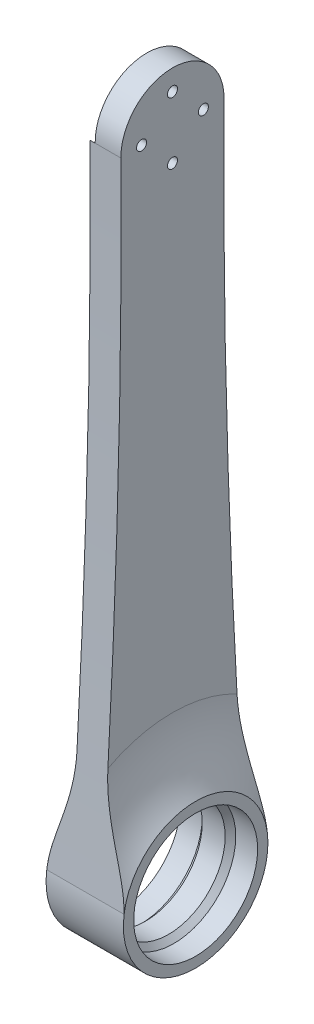
ISO-10303-21;
HEADER;
FILE_DESCRIPTION(('STEP AP214'),'2;1');
FILE_NAME('part.step','',(''),(''),'','','');
FILE_SCHEMA(('AUTOMOTIVE_DESIGN { 1 0 10303 214 1 1 1 1 }'));
ENDSEC;
DATA;
#1=APPLICATION_CONTEXT('core data for automotive mechanical design processes');
#2=APPLICATION_PROTOCOL_DEFINITION('international standard','automotive_design',2000,#1);
#3=PRODUCT_CONTEXT('',#1,'mechanical');
#4=PRODUCT('Part','Part','',(#3));
#5=PRODUCT_RELATED_PRODUCT_CATEGORY('part','',(#4));
#6=PRODUCT_DEFINITION_FORMATION('','',#4);
#7=PRODUCT_DEFINITION_CONTEXT('part definition',#1,'design');
#8=PRODUCT_DEFINITION('design','',#6,#7);
#9=PRODUCT_DEFINITION_SHAPE('','',#8);
#10=(LENGTH_UNIT() NAMED_UNIT(*) SI_UNIT(.MILLI.,.METRE.));
#11=(NAMED_UNIT(*) PLANE_ANGLE_UNIT() SI_UNIT($,.RADIAN.));
#12=(NAMED_UNIT(*) SI_UNIT($,.STERADIAN.) SOLID_ANGLE_UNIT());
#13=UNCERTAINTY_MEASURE_WITH_UNIT(LENGTH_MEASURE(1.E-05),#10,'distance_accuracy_value','');
#14=(GEOMETRIC_REPRESENTATION_CONTEXT(3) GLOBAL_UNCERTAINTY_ASSIGNED_CONTEXT((#13)) GLOBAL_UNIT_ASSIGNED_CONTEXT((#10,
#11,#12)) REPRESENTATION_CONTEXT('',''));
#15=CARTESIAN_POINT('',(0.,0.,0.));
#16=DIRECTION('',(0.,0.,1.));
#17=DIRECTION('',(1.,0.,0.));
#18=AXIS2_PLACEMENT_3D('',#15,#16,#17);
#19=CARTESIAN_POINT('',(12.5000099997899,2.24808958651116E-11,-481.831385650788));
#20=DIRECTION('',(-1.,-3.56744395928794E-13,3.81916720471054E-13));
#21=DIRECTION('',(3.56744395928794E-13,-1.,0.));
#22=AXIS2_PLACEMENT_3D('',#19,#20,#21);
#23=CYLINDRICAL_SURFACE('',#22,20.);
#24=DIRECTION('',(1.,3.56744395928794E-13,-3.81916720471054E-13));
#25=VECTOR('',#24,1.);
#26=CARTESIAN_POINT('',(0.500009999797657,-0.302746842978571,-461.833677173334));
#27=LINE('',#26,#25);
#28=CARTESIAN_POINT('',(2.50000999979766,-0.302746842977857,-461.833677173334));
#29=VERTEX_POINT('',#28);
#30=CARTESIAN_POINT('',(12.5000099997977,-0.30274684297429,-461.833677173338));
#31=VERTEX_POINT('',#30);
#32=EDGE_CURVE('E166',#29,#31,#27,.T.);
#33=ORIENTED_EDGE('',*,*,#32,.T.);
#34=CARTESIAN_POINT('',(12.5000099997899,2.24808958651116E-11,-481.831385650788));
#35=DIRECTION('',(-1.,-3.56744395928794E-13,3.81916720471054E-13));
#36=DIRECTION('',(-3.56744395928794E-13,1.,0.));
#37=AXIS2_PLACEMENT_3D('',#34,#35,#36);
#38=CIRCLE('',#37,20.);
#39=CARTESIAN_POINT('',(12.5000099997825,-0.302746842975287,-501.829094128237));
#40=VERTEX_POINT('',#39);
#41=EDGE_CURVE('E160',#31,#40,#38,.T.);
#42=ORIENTED_EDGE('',*,*,#41,.T.);
#43=DIRECTION('',(1.,3.56744395928794E-13,-3.81916720471054E-13));
#44=VECTOR('',#43,1.);
#45=CARTESIAN_POINT('',(0.500009999782502,-0.302746842979568,-501.829094128232));
#46=LINE('',#45,#44);
#47=CARTESIAN_POINT('',(2.5000099997825,-0.302746842978854,-501.829094128233));
#48=VERTEX_POINT('',#47);
#49=EDGE_CURVE('E163',#48,#40,#46,.T.);
#50=ORIENTED_EDGE('',*,*,#49,.F.);
#51=CARTESIAN_POINT('',(2.50000999979011,1.89134519058236E-11,-481.831385650784));
#52=DIRECTION('',(-1.,-3.56744395928794E-13,3.81916720471054E-13));
#53=DIRECTION('',(-3.56744395928794E-13,1.,0.));
#54=AXIS2_PLACEMENT_3D('',#51,#52,#53);
#55=CIRCLE('',#54,20.);
#56=EDGE_CURVE('E157',#29,#48,#55,.T.);
#57=ORIENTED_EDGE('',*,*,#56,.F.);
#58=EDGE_LOOP('',(#33,#42,#50,#57));
#59=FACE_BOUND('',#58,.T.);
#60=ADVANCED_FACE('F37',(#59),#23,.T.);
#61=CARTESIAN_POINT('',(12.5000099997899,2.24808958651116E-11,-481.831385650788));
#62=DIRECTION('',(1.,3.56744395928794E-13,-3.81916720471054E-13));
#63=DIRECTION('',(-3.56744395928794E-13,1.,0.));
#64=AXIS2_PLACEMENT_3D('',#61,#62,#63);
#65=PLANE('',#64);
#66=CARTESIAN_POINT('',(12.5000099997857,11.999999999987,-481.831385650788));
#67=DIRECTION('',(-1.,-3.56744395928794E-13,3.81916720471054E-13));
#68=DIRECTION('',(-3.56744395928794E-13,1.,0.));
#69=AXIS2_PLACEMENT_3D('',#66,#67,#68);
#70=CIRCLE('',#69,1.95);
#71=CARTESIAN_POINT('',(12.500009999785,13.949999999987,-481.831385650788));
#72=VERTEX_POINT('',#71);
#73=EDGE_CURVE('E142',#72,#72,#70,.T.);
#74=ORIENTED_EDGE('',*,*,#73,.T.);
#75=EDGE_LOOP('',(#74));
#76=FACE_BOUND('',#75,.T.);
#77=CARTESIAN_POINT('',(12.5000099997943,-11.999999999978,-481.831385650788));
#78=DIRECTION('',(-1.,-3.56744395928794E-13,3.81916720471054E-13));
#79=DIRECTION('',(-3.56744395928794E-13,1.,0.));
#80=AXIS2_PLACEMENT_3D('',#77,#78,#79);
#81=CIRCLE('',#80,1.95);
#82=CARTESIAN_POINT('',(12.5000099997936,-10.049999999978,-481.831385650788));
#83=VERTEX_POINT('',#82);
#84=EDGE_CURVE('E154',#83,#83,#81,.T.);
#85=ORIENTED_EDGE('',*,*,#84,.T.);
#86=EDGE_LOOP('',(#85));
#87=FACE_BOUND('',#86,.T.);
#88=CARTESIAN_POINT('',(12.5000099997823,2.24808958651116E-11,-501.831385650788));
#89=CARTESIAN_POINT('',(12.5000099998267,-122.992180068807,-500.894319286759));
#90=CARTESIAN_POINT('',(12.5000099998684,-249.99999999998,-509.881385650788));
#91=B_SPLINE_CURVE_WITH_KNOTS('',2,(#88,#89,#90),.UNSPECIFIED.,.F.,.F.,(3,3),(0.,1.),.UNSPECIFIED.);
#92=CARTESIAN_POINT('',(12.5000099998528,-202.922102878342,-506.883234073973));
#93=VERTEX_POINT('',#92);
#94=EDGE_CURVE('E238',#40,#93,#91,.T.);
#95=ORIENTED_EDGE('',*,*,#94,.F.);
#96=ORIENTED_EDGE('',*,*,#41,.F.);
#97=CARTESIAN_POINT('',(12.5000099997977,2.24857944523082E-11,-461.831385650788));
#98=CARTESIAN_POINT('',(12.5000099998412,-122.992180068807,-462.768452014816));
#99=CARTESIAN_POINT('',(12.5000099998899,-249.99999999998,-453.781385650788));
#100=B_SPLINE_CURVE_WITH_KNOTS('',2,(#97,#98,#99),.UNSPECIFIED.,.F.,.F.,(3,3),(0.,1.),.UNSPECIFIED.);
#101=CARTESIAN_POINT('',(12.5000099998719,-202.922102878342,-456.779537227603));
#102=VERTEX_POINT('',#101);
#103=EDGE_CURVE('E120',#31,#102,#100,.T.);
#104=ORIENTED_EDGE('',*,*,#103,.T.);
#105=CARTESIAN_POINT('',(12.5000099998792,-249.999999999981,-481.831385650788));
#106=DIRECTION('',(-1.,-3.56744395928794E-13,3.81916720471054E-13));
#107=DIRECTION('',(-3.56744395928794E-13,1.,0.));
#108=AXIS2_PLACEMENT_3D('',#105,#106,#107);
#109=CIRCLE('',#108,53.3284493194197);
#110=EDGE_CURVE('E171',#93,#102,#109,.F.);
#111=ORIENTED_EDGE('',*,*,#110,.F.);
#112=EDGE_LOOP('',(#95,#96,#104,#111));
#113=FACE_BOUND('',#112,.T.);
#114=CARTESIAN_POINT('',(12.5000099997946,4.45930851655388E-12,-469.831385650787));
#115=DIRECTION('',(-1.,-3.56744395928794E-13,3.81916720471054E-13));
#116=DIRECTION('',(-3.56744395928794E-13,1.,0.));
#117=AXIS2_PLACEMENT_3D('',#114,#115,#116);
#118=CIRCLE('',#117,1.95);
#119=CARTESIAN_POINT('',(12.5000099997939,1.95000000000446,-469.831385650787));
#120=VERTEX_POINT('',#119);
#121=EDGE_CURVE('E148',#120,#120,#118,.T.);
#122=ORIENTED_EDGE('',*,*,#121,.T.);
#123=EDGE_LOOP('',(#122));
#124=FACE_BOUND('',#123,.T.);
#125=CARTESIAN_POINT('',(12.5000099997854,4.45930851655388E-12,-493.831385650788));
#126=DIRECTION('',(-1.,-3.56744395928794E-13,3.81916720471054E-13));
#127=DIRECTION('',(-3.56744395928794E-13,1.,0.));
#128=AXIS2_PLACEMENT_3D('',#125,#126,#127);
#129=CIRCLE('',#128,1.95);
#130=CARTESIAN_POINT('',(12.5000099997847,1.95000000000446,-493.831385650788));
#131=VERTEX_POINT('',#130);
#132=EDGE_CURVE('E134',#131,#131,#129,.T.);
#133=ORIENTED_EDGE('',*,*,#132,.T.);
#134=EDGE_LOOP('',(#133));
#135=FACE_BOUND('',#134,.T.);
#136=ADVANCED_FACE('F195',(#76,#87,#113,#124,#135),#65,.T.);
#137=CARTESIAN_POINT('',(2.50000999979011,1.89134519058236E-11,-481.831385650784));
#138=DIRECTION('',(1.,3.56744395928794E-13,-3.81916720471054E-13));
#139=DIRECTION('',(-3.56744395928794E-13,1.,0.));
#140=AXIS2_PLACEMENT_3D('',#137,#138,#139);
#141=PLANE('',#140);
#142=EDGE_CURVE('E124',#48,#29,#55,.T.);
#143=ORIENTED_EDGE('',*,*,#142,.T.);
#144=ORIENTED_EDGE('',*,*,#56,.T.);
#145=EDGE_LOOP('',(#143,#144));
#146=FACE_BOUND('',#145,.T.);
#147=CARTESIAN_POINT('',(2.50000999979433,-11.9999999999816,-481.831385650784));
#148=DIRECTION('',(-1.,-3.56744395928794E-13,3.81916720471054E-13));
#149=DIRECTION('',(-3.56744395928794E-13,1.,0.));
#150=AXIS2_PLACEMENT_3D('',#147,#148,#149);
#151=CIRCLE('',#150,1.95);
#152=CARTESIAN_POINT('',(2.50000999979363,-10.0499999999816,-481.831385650784));
#153=VERTEX_POINT('',#152);
#154=EDGE_CURVE('E151',#153,#153,#151,.T.);
#155=ORIENTED_EDGE('',*,*,#154,.F.);
#156=EDGE_LOOP('',(#155));
#157=FACE_BOUND('',#156,.T.);
#158=CARTESIAN_POINT('',(2.50000999979455,8.91864557265945E-13,-469.831385650783));
#159=DIRECTION('',(-1.,-3.56744395928794E-13,3.81916720471054E-13));
#160=DIRECTION('',(-3.56744395928794E-13,1.,0.));
#161=AXIS2_PLACEMENT_3D('',#158,#159,#160);
#162=CIRCLE('',#161,1.95);
#163=CARTESIAN_POINT('',(2.50000999979385,1.95000000000089,-469.831385650783));
#164=VERTEX_POINT('',#163);
#165=EDGE_CURVE('E145',#164,#164,#162,.T.);
#166=ORIENTED_EDGE('',*,*,#165,.F.);
#167=EDGE_LOOP('',(#166));
#168=FACE_BOUND('',#167,.T.);
#169=CARTESIAN_POINT('',(2.50000999978567,11.9999999999834,-481.831385650784));
#170=DIRECTION('',(-1.,-3.56744395928794E-13,3.81916720471054E-13));
#171=DIRECTION('',(-3.56744395928794E-13,1.,0.));
#172=AXIS2_PLACEMENT_3D('',#169,#170,#171);
#173=CIRCLE('',#172,1.95);
#174=CARTESIAN_POINT('',(2.50000999978497,13.9499999999834,-481.831385650784));
#175=VERTEX_POINT('',#174);
#176=EDGE_CURVE('E137',#175,#175,#173,.T.);
#177=ORIENTED_EDGE('',*,*,#176,.F.);
#178=EDGE_LOOP('',(#177));
#179=FACE_BOUND('',#178,.T.);
#180=CARTESIAN_POINT('',(2.50000999978539,8.91864557265945E-13,-493.831385650784));
#181=DIRECTION('',(-1.,-3.56744395928794E-13,3.81916720471054E-13));
#182=DIRECTION('',(-3.56744395928794E-13,1.,0.));
#183=AXIS2_PLACEMENT_3D('',#180,#181,#182);
#184=CIRCLE('',#183,1.95);
#185=CARTESIAN_POINT('',(2.5000099997847,1.95000000000089,-493.831385650784));
#186=VERTEX_POINT('',#185);
#187=EDGE_CURVE('E138',#186,#186,#184,.T.);
#188=ORIENTED_EDGE('',*,*,#187,.F.);
#189=EDGE_LOOP('',(#188));
#190=FACE_BOUND('',#189,.T.);
#191=ADVANCED_FACE('F197',(#146,#157,#168,#179,#190),#141,.F.);
#192=CARTESIAN_POINT('',(12.5000099997943,-11.999999999978,-481.831385650788));
#193=DIRECTION('',(-1.,-3.56744395928794E-13,3.81916720471054E-13));
#194=DIRECTION('',(3.56744395928794E-13,-1.,0.));
#195=AXIS2_PLACEMENT_3D('',#192,#193,#194);
#196=CYLINDRICAL_SURFACE('',#195,1.95);
#197=ORIENTED_EDGE('',*,*,#84,.F.);
#198=EDGE_LOOP('',(#197));
#199=FACE_BOUND('',#198,.T.);
#200=ORIENTED_EDGE('',*,*,#154,.T.);
#201=EDGE_LOOP('',(#200));
#202=FACE_BOUND('',#201,.T.);
#203=ADVANCED_FACE('F200',(#199,#202),#196,.F.);
#204=CARTESIAN_POINT('',(12.5000099997946,4.45930851655388E-12,-469.831385650787));
#205=DIRECTION('',(-1.,-3.56744395928794E-13,3.81916720471054E-13));
#206=DIRECTION('',(3.56744395928794E-13,-1.,0.));
#207=AXIS2_PLACEMENT_3D('',#204,#205,#206);
#208=CYLINDRICAL_SURFACE('',#207,1.95);
#209=ORIENTED_EDGE('',*,*,#121,.F.);
#210=EDGE_LOOP('',(#209));
#211=FACE_BOUND('',#210,.T.);
#212=ORIENTED_EDGE('',*,*,#165,.T.);
#213=EDGE_LOOP('',(#212));
#214=FACE_BOUND('',#213,.T.);
#215=ADVANCED_FACE('F207',(#211,#214),#208,.F.);
#216=CARTESIAN_POINT('',(12.5000099997857,11.999999999987,-481.831385650788));
#217=DIRECTION('',(-1.,-3.56744395928794E-13,3.81916720471054E-13));
#218=DIRECTION('',(3.56744395928794E-13,-1.,0.));
#219=AXIS2_PLACEMENT_3D('',#216,#217,#218);
#220=CYLINDRICAL_SURFACE('',#219,1.95);
#221=ORIENTED_EDGE('',*,*,#73,.F.);
#222=EDGE_LOOP('',(#221));
#223=FACE_BOUND('',#222,.T.);
#224=ORIENTED_EDGE('',*,*,#176,.T.);
#225=EDGE_LOOP('',(#224));
#226=FACE_BOUND('',#225,.T.);
#227=ADVANCED_FACE('F211',(#223,#226),#220,.F.);
#228=CARTESIAN_POINT('',(12.5000099997854,4.45930851655388E-12,-493.831385650788));
#229=DIRECTION('',(-1.,-3.56744395928794E-13,3.81916720471054E-13));
#230=DIRECTION('',(3.56744395928794E-13,-1.,0.));
#231=AXIS2_PLACEMENT_3D('',#228,#229,#230);
#232=CYLINDRICAL_SURFACE('',#231,1.95);
#233=ORIENTED_EDGE('',*,*,#132,.F.);
#234=EDGE_LOOP('',(#233));
#235=FACE_BOUND('',#234,.T.);
#236=ORIENTED_EDGE('',*,*,#187,.T.);
#237=EDGE_LOOP('',(#236));
#238=FACE_BOUND('',#237,.T.);
#239=ADVANCED_FACE('F215',(#235,#238),#232,.F.);
#240=CARTESIAN_POINT('',(0.500009999790108,1.81999631139661E-11,-481.831385650783));
#241=DIRECTION('',(1.,3.56744395928794E-13,-3.81916720471054E-13));
#242=DIRECTION('',(-3.56744395928794E-13,1.,0.));
#243=AXIS2_PLACEMENT_3D('',#240,#241,#242);
#244=CYLINDRICAL_SURFACE('',#243,20.);
#245=DIRECTION('',(1.,3.56744395928794E-13,-3.81916720471054E-13));
#246=VECTOR('',#245,1.);
#247=CARTESIAN_POINT('',(0.500009999782502,-0.302746842979568,-501.829094128232));
#248=LINE('',#247,#246);
#249=CARTESIAN_POINT('',(0.500009999782502,-0.302746842979568,-501.829094128232));
#250=VERTEX_POINT('',#249);
#251=EDGE_CURVE('E106',#250,#48,#248,.T.);
#252=ORIENTED_EDGE('',*,*,#251,.F.);
#253=CARTESIAN_POINT('',(0.500009999790108,1.81999631139661E-11,-481.831385650783));
#254=DIRECTION('',(-1.,-3.56744273356773E-13,3.81916720471054E-13));
#255=DIRECTION('',(-3.56744273356773E-13,1.,0.));
#256=AXIS2_PLACEMENT_3D('',#253,#254,#255);
#257=CIRCLE('',#256,20.);
#258=CARTESIAN_POINT('',(0.500009999797657,-0.302746842978571,-461.833677173334));
#259=VERTEX_POINT('',#258);
#260=EDGE_CURVE('E113',#250,#259,#257,.T.);
#261=ORIENTED_EDGE('',*,*,#260,.T.);
#262=DIRECTION('',(1.,3.56744395928794E-13,-3.81916720471054E-13));
#263=VECTOR('',#262,1.);
#264=CARTESIAN_POINT('',(0.500009999797657,-0.302746842978571,-461.833677173334));
#265=LINE('',#264,#263);
#266=EDGE_CURVE('E141',#259,#29,#265,.T.);
#267=ORIENTED_EDGE('',*,*,#266,.T.);
#268=ORIENTED_EDGE('',*,*,#142,.F.);
#269=EDGE_LOOP('',(#252,#261,#267,#268));
#270=FACE_BOUND('',#269,.T.);
#271=ADVANCED_FACE('F122',(#270),#244,.F.);
#272=CARTESIAN_POINT('',(0.500009999797657,1.82048617011626E-11,-461.831385650783));
#273=CARTESIAN_POINT('',(0.500009999841178,-122.992180068812,-462.768452014812));
#274=CARTESIAN_POINT('',(0.500009999889917,-249.999999999985,-453.781385650783));
#275=B_SPLINE_CURVE_WITH_KNOTS('',2,(#272,#273,#274),.UNSPECIFIED.,.F.,.F.,(3,3),(0.,1.),.UNSPECIFIED.);
#276=DIRECTION('',(1.,3.56744395928794E-13,-3.81916720471054E-13));
#277=VECTOR('',#276,1.);
#278=SURFACE_OF_LINEAR_EXTRUSION('',#275,#277);
#279=ORIENTED_EDGE('',*,*,#103,.F.);
#280=ORIENTED_EDGE('',*,*,#32,.F.);
#281=ORIENTED_EDGE('',*,*,#266,.F.);
#282=CARTESIAN_POINT('',(0.500009999871931,-202.922102878079,-456.779537227613));
#283=VERTEX_POINT('',#282);
#284=EDGE_CURVE('E112',#259,#283,#275,.T.);
#285=ORIENTED_EDGE('',*,*,#284,.T.);
#286=CARTESIAN_POINT('',(-8.4999900001993,-246.082508761869,-454.056293168497));
#287=CARTESIAN_POINT('',(-8.47780124457364,-245.697302445124,-454.083099189043));
#288=CARTESIAN_POINT('',(-8.44910038244521,-245.312487799194,-454.109811193874));
#289=CARTESIAN_POINT('',(-8.37949399686529,-244.545393738455,-454.162927079009));
#290=CARTESIAN_POINT('',(-8.33863441372825,-244.163110221598,-454.189331737129));
#291=CARTESIAN_POINT('',(-8.2454733122115,-243.400926066505,-454.241845999957));
#292=CARTESIAN_POINT('',(-8.19320130301964,-243.021021835263,-454.267956186268));
#293=CARTESIAN_POINT('',(-8.07812031444582,-242.263407846592,-454.319896912379));
#294=CARTESIAN_POINT('',(-8.01532782893739,-241.885695597032,-454.345727823568));
#295=CARTESIAN_POINT('',(-7.88015878924594,-241.132271514419,-454.397125459872));
#296=CARTESIAN_POINT('',(-7.80778939428738,-240.756558403037,-454.422692367102));
#297=CARTESIAN_POINT('',(-7.65445961360112,-240.006930426495,-454.473577714533));
#298=CARTESIAN_POINT('',(-7.57350032425545,-239.633015338196,-454.498896185994));
#299=CARTESIAN_POINT('',(-7.40398644458714,-238.886731051887,-454.549303462123));
#300=CARTESIAN_POINT('',(-7.3154285736859,-238.514362595091,-454.574392162364));
#301=CARTESIAN_POINT('',(-7.13173120082055,-237.771021693644,-454.62435144349));
#302=CARTESIAN_POINT('',(-7.03658803655111,-237.400050148755,-454.649221894194));
#303=CARTESIAN_POINT('',(-6.84070662371535,-236.659308634767,-454.698758981315));
#304=CARTESIAN_POINT('',(-6.73996462807134,-236.289539650038,-454.723425468229));
#305=CARTESIAN_POINT('',(-6.53384257252319,-235.551016835316,-454.772568122025));
#306=CARTESIAN_POINT('',(-6.42845941550083,-235.182263863178,-454.797044148589));
#307=CARTESIAN_POINT('',(-6.21397601737651,-234.445596713061,-454.845818457908));
#308=CARTESIAN_POINT('',(-6.10487363519271,-234.077683152912,-454.870116628153));
#309=CARTESIAN_POINT('',(-5.88382468995328,-233.342531465404,-454.918546676014));
#310=CARTESIAN_POINT('',(-5.77187693902601,-232.975293691129,-454.942678478648));
#311=CARTESIAN_POINT('',(-5.40999586038022,-231.799506253638,-455.019747088285));
#312=CARTESIAN_POINT('',(-5.15625178627276,-230.992114372056,-455.072373777973));
#313=CARTESIAN_POINT('',(-4.64696802847291,-229.377958863465,-455.176998718855));
#314=CARTESIAN_POINT('',(-4.39142853027719,-228.571195180848,-455.228997033504));
#315=CARTESIAN_POINT('',(-3.88527659243146,-226.956649699534,-455.332469915783));
#316=CARTESIAN_POINT('',(-3.63466107653949,-226.148868895216,-455.383944800055));
#317=CARTESIAN_POINT('',(-3.14409901270373,-224.53095051944,-455.486451556783));
#318=CARTESIAN_POINT('',(-2.90414155119768,-223.720816308151,-455.537483837236));
#319=CARTESIAN_POINT('',(-2.43978492301979,-222.097106370467,-455.639166589348));
#320=CARTESIAN_POINT('',(-2.21536736263337,-221.283535965412,-455.689817446891));
#321=CARTESIAN_POINT('',(-1.78628120717741,-219.652077806925,-455.790782729681));
#322=CARTESIAN_POINT('',(-1.58159187463833,-218.834195561486,-455.841097455299));
#323=CARTESIAN_POINT('',(-1.19585623627954,-217.194510154538,-455.941355718022));
#324=CARTESIAN_POINT('',(-1.01476452337849,-216.372717774196,-455.991299788248));
#325=CARTESIAN_POINT('',(-0.679086302081177,-214.72348509408,-456.090911675775));
#326=CARTESIAN_POINT('',(-0.524506057102014,-213.896043507543,-456.140579425121));
#327=CARTESIAN_POINT('',(-0.244700074379684,-212.234714919652,-456.239673132202));
#328=CARTESIAN_POINT('',(-0.119524529577258,-211.400819371441,-456.289098537503));
#329=CARTESIAN_POINT('',(0.0987705351191311,-209.725813518813,-456.387738116698));
#330=CARTESIAN_POINT('',(0.191775755521887,-208.884688154379,-456.436950936163));
#331=CARTESIAN_POINT('',(0.343052826991372,-207.194397034611,-456.535196796072));
#332=CARTESIAN_POINT('',(0.401123743007653,-206.345212774321,-456.584227214233));
#333=CARTESIAN_POINT('',(0.460020533796629,-205.066648785813,-456.657553190388));
#334=CARTESIAN_POINT('',(0.474953626163886,-204.637897123308,-456.682058467402));
#335=CARTESIAN_POINT('',(0.494949348239617,-203.78013923591,-456.730915809261));
#336=CARTESIAN_POINT('',(0.500011594932706,-203.351133001784,-456.755267868124));
#337=CARTESIAN_POINT('',(0.500009999871931,-202.922102878079,-456.779537227613));
#338=B_SPLINE_CURVE_WITH_KNOTS('',3,(#286,#287,#288,#289,#290,#291,#292,#293,#294,#295,#296,
#297,#298,#299,#300,#301,#302,#303,#304,#305,#306,#307,#308,#309,#310,#311,#312,#313,#314,#315,
#316,#317,#318,#319,#320,#321,#322,#323,#324,#325,#326,#327,#328,#329,#330,#331,#332,#333,#334,
#335,#336,#337),.UNSPECIFIED.,.F.,.F.,(4,2,2,2,2,2,2,2,2,2,2,2,2,2,2,2,2,2,2,2,2,2,2,2,2,4),(0.,
1.16023626743979,2.31614320786222,3.46909598150033,4.62025780043684,5.77056387827698,
6.92072331156419,8.07138183259926,9.22268549698106,10.3747691863162,11.5276336864299,
12.6811734631706,13.8352029917993,16.379057908297,18.9226537584687,21.4646064441353,
24.0038932247779,26.5401211152042,29.0736532711837,31.6022359994823,34.1314152928898,
36.6648809474156,39.2072575790064,41.7641210059503,43.0531542129777,44.3422374369682),.UNSPECIFIED.);
#339=CARTESIAN_POINT('',(-8.4999900001993,-246.082508761868,-454.056293168497));
#340=VERTEX_POINT('',#339);
#341=EDGE_CURVE('E179',#340,#283,#338,.T.);
#342=ORIENTED_EDGE('',*,*,#341,.F.);
#343=DIRECTION('',(1.,3.56744395928794E-13,-3.81916720471054E-13));
#344=VECTOR('',#343,1.);
#345=CARTESIAN_POINT('',(0.500009999888307,-246.082508761866,-454.056293168501));
#346=LINE('',#345,#344);
#347=CARTESIAN_POINT('',(21.5000099998005,-246.08250876186,-454.05629316851));
#348=VERTEX_POINT('',#347);
#349=EDGE_CURVE('E129',#340,#348,#346,.T.);
#350=ORIENTED_EDGE('',*,*,#349,.T.);
#351=CARTESIAN_POINT('',(12.5000099998719,-202.922102878341,-456.779537227603));
#352=CARTESIAN_POINT('',(12.4999979592666,-203.524949854835,-456.745435578834));
#353=CARTESIAN_POINT('',(12.5100002752874,-204.127761970439,-456.711169662582));
#354=CARTESIAN_POINT('',(12.5492311636256,-205.33107152827,-456.642439171708));
#355=CARTESIAN_POINT('',(12.5784062706048,-205.931570749787,-456.607975412947));
#356=CARTESIAN_POINT('',(12.6551149091392,-207.130211563465,-456.538855792085));
#357=CARTESIAN_POINT('',(12.7026130678796,-207.728355468641,-456.504200426169));
#358=CARTESIAN_POINT('',(12.8150821988126,-208.922262466551,-456.434703358533));
#359=CARTESIAN_POINT('',(12.8800323906708,-209.518027541078,-456.399861926411));
#360=CARTESIAN_POINT('',(13.0265068743465,-210.707151015231,-456.329998544602));
#361=CARTESIAN_POINT('',(13.1080216749865,-211.300510595467,-456.294976709431));
#362=CARTESIAN_POINT('',(13.2866891678941,-212.484802286241,-456.224758055328));
#363=CARTESIAN_POINT('',(13.383840582679,-213.075734591041,-456.189561250917));
#364=CARTESIAN_POINT('',(13.5926379207225,-214.254296008979,-456.119049312881));
#365=CARTESIAN_POINT('',(13.7042666162223,-214.841928195638,-456.083734367741));
#366=CARTESIAN_POINT('',(13.9410582033803,-216.014705134274,-456.012942491669));
#367=CARTESIAN_POINT('',(14.0662269001992,-216.599848706643,-455.977465497554));
#368=CARTESIAN_POINT('',(14.328940163098,-217.76765332306,-455.906353436343));
#369=CARTESIAN_POINT('',(14.4664911279102,-218.350312918696,-455.870718296671));
#370=CARTESIAN_POINT('',(14.7526984131349,-219.513181759885,-455.799292097996));
#371=CARTESIAN_POINT('',(14.9013601060049,-220.093389674816,-455.763500971549));
#372=CARTESIAN_POINT('',(15.2083857974913,-221.251419491489,-455.691762817542));
#373=CARTESIAN_POINT('',(15.366752968983,-221.829240546321,-455.655815742606));
#374=CARTESIAN_POINT('',(15.6916322296262,-222.982598425528,-455.583763156175));
#375=CARTESIAN_POINT('',(15.8581446823634,-223.558135146694,-455.547657637672));
#376=CARTESIAN_POINT('',(16.2063014730704,-224.736579008824,-455.473423716858));
#377=CARTESIAN_POINT('',(16.3882844438385,-225.339385163934,-455.435286052961));
#378=CARTESIAN_POINT('',(16.7572209442123,-226.543275534264,-455.358792421829));
#379=CARTESIAN_POINT('',(16.9441731242741,-227.144360168873,-455.320436516045));
#380=CARTESIAN_POINT('',(17.3206495784667,-228.345451023712,-455.243467827952));
#381=CARTESIAN_POINT('',(17.5101728476858,-228.945457567063,-455.204855148849));
#382=CARTESIAN_POINT('',(17.8891017812052,-230.145126694131,-455.127326993161));
#383=CARTESIAN_POINT('',(18.0785074532378,-230.744789286847,-455.088411693338));
#384=CARTESIAN_POINT('',(18.4541890333498,-231.944606662825,-455.010224094892));
#385=CARTESIAN_POINT('',(18.6404670704255,-232.54476079324,-454.970952069692));
#386=CARTESIAN_POINT('',(19.0065368804103,-233.746506459586,-454.891987798885));
#387=CARTESIAN_POINT('',(19.1863336931377,-234.348096473092,-454.852295912249));
#388=CARTESIAN_POINT('',(19.536129919195,-235.55513171463,-454.772329076229));
#389=CARTESIAN_POINT('',(19.7061134897541,-236.160581515841,-454.732053308491));
#390=CARTESIAN_POINT('',(20.0317810447893,-237.375157974649,-454.650924004274));
#391=CARTESIAN_POINT('',(20.1874684405855,-237.984283717938,-454.610070608326));
#392=CARTESIAN_POINT('',(20.4801867726431,-239.207335926624,-454.527704136137));
#393=CARTESIAN_POINT('',(20.6172079078173,-239.821264736445,-454.486190726019));
#394=CARTESIAN_POINT('',(20.8681040614308,-241.055114751635,-454.402415291321));
#395=CARTESIAN_POINT('',(20.9819337167084,-241.675045263127,-454.360151972058));
#396=CARTESIAN_POINT('',(21.1319199027028,-242.609559045495,-454.296179842696));
#397=CARTESIAN_POINT('',(21.1785317615478,-242.922497783822,-454.274713751312));
#398=CARTESIAN_POINT('',(21.2642070496743,-243.549396297836,-454.231623084999));
#399=CARTESIAN_POINT('',(21.3032706476531,-243.863356050545,-454.209998513622));
#400=CARTESIAN_POINT('',(21.3736427416207,-244.494428624763,-454.166442922333));
#401=CARTESIAN_POINT('',(21.4048932948977,-244.811547859357,-454.144510817058));
#402=CARTESIAN_POINT('',(21.4589088081837,-245.44652717392,-454.100504767514));
#403=CARTESIAN_POINT('',(21.4816729654024,-245.764387321116,-454.078430810026));
#404=CARTESIAN_POINT('',(21.5000099997987,-246.082508761859,-454.056293168509));
#405=B_SPLINE_CURVE_WITH_KNOTS('',3,(#351,#352,#353,#354,#355,#356,#357,#358,#359,#360,#361,
#362,#363,#364,#365,#366,#367,#368,#369,#370,#371,#372,#373,#374,#375,#376,#377,#378,#379,#380,
#381,#382,#383,#384,#385,#386,#387,#388,#389,#390,#391,#392,#393,#394,#395,#396,#397,#398,#399,
#400,#401,#402,#403,#404),.UNSPECIFIED.,.F.,.F.,(4,2,2,2,2,2,2,2,2,2,2,2,2,2,2,2,2,2,2,2,2,2,2,
2,2,2,4),(0.,1.81131161490772,3.61759350966533,5.42040567205488,7.22108064578722,
9.02072676461509,10.8202259302077,12.6176030354222,14.4157538281996,16.2148392373578,
18.0148002718063,19.8153529139617,21.6159860019277,23.5084459898723,25.4003971692274,
27.2916290444749,29.1818287278443,31.0706848211169,32.9580389776444,34.8483594990483,
36.7382277780115,38.6290845759683,40.5236051642026,41.4748839353375,42.4261414437229,
43.3842572603633,44.3424636892128),.UNSPECIFIED.);
#406=EDGE_CURVE('E11',#102,#348,#405,.T.);
#407=ORIENTED_EDGE('',*,*,#406,.F.);
#408=EDGE_LOOP('',(#279,#280,#281,#285,#342,#350,#407));
#409=FACE_BOUND('',#408,.T.);
#410=ADVANCED_FACE('F220',(#409),#278,.T.);
#411=CARTESIAN_POINT('',(0.50000999978228,1.81999631139661E-11,-501.831385650783));
#412=CARTESIAN_POINT('',(0.500009999826689,-122.992180068812,-500.894319286754));
#413=CARTESIAN_POINT('',(0.500009999868378,-249.999999999985,-509.881385650783));
#414=B_SPLINE_CURVE_WITH_KNOTS('',2,(#411,#412,#413),.UNSPECIFIED.,.F.,.F.,(3,3),(0.,1.),.UNSPECIFIED.);
#415=DIRECTION('',(1.,3.56744395928794E-13,-3.81916720471054E-13));
#416=VECTOR('',#415,1.);
#417=SURFACE_OF_LINEAR_EXTRUSION('',#414,#416);
#418=ORIENTED_EDGE('',*,*,#94,.T.);
#419=CARTESIAN_POINT('',(21.5000099997792,-246.082508761858,-509.606478133072));
#420=CARTESIAN_POINT('',(21.4778212441498,-245.697302445095,-509.579672112526));
#421=CARTESIAN_POINT('',(21.4491203820186,-245.312487799147,-509.552960107694));
#422=CARTESIAN_POINT('',(21.3795139964337,-244.54539373837,-509.499844222557));
#423=CARTESIAN_POINT('',(21.3386544132943,-244.163110221495,-509.473439564435));
#424=CARTESIAN_POINT('',(21.2454933117716,-243.400926066365,-509.420925301605));
#425=CARTESIAN_POINT('',(21.1932213025761,-243.021021835106,-509.394815115292));
#426=CARTESIAN_POINT('',(21.0781403139945,-242.263407846398,-509.342874389179));
#427=CARTESIAN_POINT('',(21.0153478284819,-241.88569559682,-509.317043477989));
#428=CARTESIAN_POINT('',(20.8801787887814,-241.132271514171,-509.265645841682));
#429=CARTESIAN_POINT('',(20.807809393818,-240.756558402771,-509.240078934451));
#430=CARTESIAN_POINT('',(20.6544796131215,-240.006930426194,-509.189193587018));
#431=CARTESIAN_POINT('',(20.5735203237705,-239.633015337877,-509.163875115556));
#432=CARTESIAN_POINT('',(20.4040064440913,-238.886731051533,-509.113467839425));
#433=CARTESIAN_POINT('',(20.3154485731845,-238.514362594719,-509.088379139182));
#434=CARTESIAN_POINT('',(20.1317512003077,-237.771021693237,-509.038419858054));
#435=CARTESIAN_POINT('',(20.0366080360324,-237.40005014833,-509.013549407349));
#436=CARTESIAN_POINT('',(19.8407266231848,-236.659308634307,-508.964012320225));
#437=CARTESIAN_POINT('',(19.7399846275349,-236.28953964956,-508.93934583331));
#438=CARTESIAN_POINT('',(19.5338625719749,-235.551016834804,-508.890203179512));
#439=CARTESIAN_POINT('',(19.4284794149467,-235.182263862648,-508.865727152947));
#440=CARTESIAN_POINT('',(19.2139960168107,-234.445596712497,-508.816952843626));
#441=CARTESIAN_POINT('',(19.1048936346211,-234.077683152329,-508.792654673379));
#442=CARTESIAN_POINT('',(18.8838446893703,-233.342531464786,-508.744224625516));
#443=CARTESIAN_POINT('',(18.7718969384375,-232.975293690493,-508.720092822882));
#444=CARTESIAN_POINT('',(18.4100158597943,-231.799506253011,-508.643024213245));
#445=CARTESIAN_POINT('',(18.1562717856963,-230.992114371454,-508.590397523559));
#446=CARTESIAN_POINT('',(17.6469880279173,-229.377958862912,-508.48577258268));
#447=CARTESIAN_POINT('',(17.391448529733,-228.571195180321,-508.433774268033));
#448=CARTESIAN_POINT('',(16.8852965919111,-226.956649699055,-508.330301385757));
#449=CARTESIAN_POINT('',(16.6346810760315,-226.148868894761,-508.278826501487));
#450=CARTESIAN_POINT('',(16.144119012221,-224.530950519033,-508.176319744762));
#451=CARTESIAN_POINT('',(15.9041615507277,-223.720816307769,-508.125287464311));
#452=CARTESIAN_POINT('',(15.439804922575,-222.097106370133,-508.023604712202));
#453=CARTESIAN_POINT('',(15.2153873622011,-221.283535965103,-507.972953854661));
#454=CARTESIAN_POINT('',(14.7863012067693,-219.652077806665,-507.871988571874));
#455=CARTESIAN_POINT('',(14.581611874242,-218.83419556125,-507.821673846258));
#456=CARTESIAN_POINT('',(14.1958762359055,-217.194510154352,-507.721415583537));
#457=CARTESIAN_POINT('',(14.0147845230151,-216.372717774034,-507.671471513313));
#458=CARTESIAN_POINT('',(13.6791063017375,-214.723485093968,-507.571859625789));
#459=CARTESIAN_POINT('',(13.5245260567675,-213.896043507457,-507.522191876445));
#460=CARTESIAN_POINT('',(13.2447200740619,-212.234714919617,-507.423098169366));
#461=CARTESIAN_POINT('',(13.1195445292669,-211.400819371431,-507.373672764068));
#462=CARTESIAN_POINT('',(12.9012494645836,-209.725813518855,-507.275033184875));
#463=CARTESIAN_POINT('',(12.8082442441864,-208.884688154448,-507.225820365411));
#464=CARTESIAN_POINT('',(12.6569671727257,-207.194397034734,-507.127574505506));
#465=CARTESIAN_POINT('',(12.5988962567128,-206.345212774471,-507.078544087346));
#466=CARTESIAN_POINT('',(12.5399994659269,-205.066648786004,-507.005218111194));
#467=CARTESIAN_POINT('',(12.5250663735603,-204.637897123513,-506.98071283418));
#468=CARTESIAN_POINT('',(12.5050706514854,-203.780139236143,-506.931855492323));
#469=CARTESIAN_POINT('',(12.5000084047923,-203.351133002032,-506.907503433461));
#470=CARTESIAN_POINT('',(12.5000099998528,-202.922102878341,-506.883234073973));
#471=B_SPLINE_CURVE_WITH_KNOTS('',3,(#419,#420,#421,#422,#423,#424,#425,#426,#427,#428,#429,
#430,#431,#432,#433,#434,#435,#436,#437,#438,#439,#440,#441,#442,#443,#444,#445,#446,#447,#448,
#449,#450,#451,#452,#453,#454,#455,#456,#457,#458,#459,#460,#461,#462,#463,#464,#465,#466,#467,
#468,#469,#470),.UNSPECIFIED.,.F.,.F.,(4,2,2,2,2,2,2,2,2,2,2,2,2,2,2,2,2,2,2,2,2,2,2,2,2,4),(0.,
1.16023626749587,2.31614320797418,3.46909598166783,4.62025780065983,5.77056387855533,
6.92072331189792,8.07138183298839,9.22268549742563,10.3747691868162,11.5276336869855,
12.6811734637818,13.8352029924662,16.3790579088831,18.922653758974,21.4646064445598,
24.0038932251216,26.5401211154674,29.0736532713667,31.6022359995859,34.1314152929141,
36.66488094736,39.20725757887,41.7641210057314,43.0531542127162,44.3422374366644),.UNSPECIFIED.);
#472=CARTESIAN_POINT('',(21.5000099997792,-246.08250876186,-509.606478133072));
#473=VERTEX_POINT('',#472);
#474=EDGE_CURVE('E51',#473,#93,#471,.T.);
#475=ORIENTED_EDGE('',*,*,#474,.F.);
#476=DIRECTION('',(1.,3.56744395928794E-13,-3.81916720471054E-13));
#477=VECTOR('',#476,1.);
#478=CARTESIAN_POINT('',(0.500009999867046,-246.082508761866,-509.606478133064));
#479=LINE('',#478,#477);
#480=CARTESIAN_POINT('',(-8.49999000022056,-246.082508761869,-509.606478133062));
#481=VERTEX_POINT('',#480);
#482=EDGE_CURVE('E126',#481,#473,#479,.T.);
#483=ORIENTED_EDGE('',*,*,#482,.F.);
#484=CARTESIAN_POINT('',(0.50000999985278,-202.922102878079,-506.883234073953));
#485=CARTESIAN_POINT('',(0.5000220404586,-203.524949854569,-506.917335722721));
#486=CARTESIAN_POINT('',(0.490019724438294,-204.127761970171,-506.951601638973));
#487=CARTESIAN_POINT('',(0.450788836101135,-205.331071527996,-507.020332129847));
#488=CARTESIAN_POINT('',(0.421613729122586,-205.931570749511,-507.054795888607));
#489=CARTESIAN_POINT('',(0.344905090589479,-207.130211563183,-507.123915509469));
#490=CARTESIAN_POINT('',(0.297406931849685,-207.728355468356,-507.158570875384));
#491=CARTESIAN_POINT('',(0.184937800918172,-208.922262466261,-507.228067943021));
#492=CARTESIAN_POINT('',(0.119987609060677,-209.518027540784,-507.262909375142));
#493=CARTESIAN_POINT('',(-0.0264868746134133,-210.707151014932,-507.332772756951));
#494=CARTESIAN_POINT('',(-0.108001675252636,-211.300510595166,-507.367794592121));
#495=CARTESIAN_POINT('',(-0.286669168158657,-212.484802285934,-507.438013246224));
#496=CARTESIAN_POINT('',(-0.383820582942676,-213.075734590731,-507.473210050635));
#497=CARTESIAN_POINT('',(-0.592617920984605,-214.254296008663,-507.54372198867));
#498=CARTESIAN_POINT('',(-0.704246616483593,-214.84192819532,-507.57903693381));
#499=CARTESIAN_POINT('',(-0.941038203640071,-216.014705133951,-507.649828809881));
#500=CARTESIAN_POINT('',(-1.06620690045818,-216.599848706316,-507.685305803996));
#501=CARTESIAN_POINT('',(-1.3289201633555,-217.767653322728,-507.756417865207));
#502=CARTESIAN_POINT('',(-1.466471128167,-218.350312918361,-507.792053004879));
#503=CARTESIAN_POINT('',(-1.75267841339046,-219.513181759544,-507.863479203553));
#504=CARTESIAN_POINT('',(-1.90134010625989,-220.093389674473,-507.899270329999));
#505=CARTESIAN_POINT('',(-2.20836579774533,-221.25141949114,-507.971008484007));
#506=CARTESIAN_POINT('',(-2.36673296923658,-221.829240545969,-508.006955558942));
#507=CARTESIAN_POINT('',(-2.69161222987905,-222.982598425171,-508.079008145373));
#508=CARTESIAN_POINT('',(-2.85812468261603,-223.558135146333,-508.115113663875));
#509=CARTESIAN_POINT('',(-3.20628147332703,-224.73657900847,-508.189347584689));
#510=CARTESIAN_POINT('',(-3.38826444409939,-225.339385163591,-508.227485248587));
#511=CARTESIAN_POINT('',(-3.7572009444823,-226.543275533942,-508.30397887972));
#512=CARTESIAN_POINT('',(-3.94415312454882,-227.144360168561,-508.342334785505));
#513=CARTESIAN_POINT('',(-4.32062957875161,-228.34545102342,-508.4193034736));
#514=CARTESIAN_POINT('',(-4.51015284797596,-228.945457566781,-508.457916152703));
#515=CARTESIAN_POINT('',(-4.88908178150632,-230.145126693869,-508.535444308392));
#516=CARTESIAN_POINT('',(-5.07848745354457,-230.744789286595,-508.574359608215));
#517=CARTESIAN_POINT('',(-5.45416903366815,-231.944606662593,-508.652547206663));
#518=CARTESIAN_POINT('',(-5.64044707074975,-232.544760793018,-508.691819231863));
#519=CARTESIAN_POINT('',(-6.00651688074661,-233.746506459384,-508.770783502672));
#520=CARTESIAN_POINT('',(-6.18631369348003,-234.348096472899,-508.810475389308));
#521=CARTESIAN_POINT('',(-6.53610991954934,-235.555131714457,-508.890442225329));
#522=CARTESIAN_POINT('',(-6.70609349011433,-236.160581515678,-508.930717993068));
#523=CARTESIAN_POINT('',(-7.03176104516117,-237.375157974507,-509.011847297287));
#524=CARTESIAN_POINT('',(-7.18744844096309,-237.984283717806,-509.052700693235));
#525=CARTESIAN_POINT('',(-7.48016677303163,-239.207335926512,-509.135067165426));
#526=CARTESIAN_POINT('',(-7.61718790821101,-239.821264736343,-509.176580575544));
#527=CARTESIAN_POINT('',(-7.86808406183376,-241.055114751554,-509.260356010244));
#528=CARTESIAN_POINT('',(-7.98191371711549,-241.675045263057,-509.302619329507));
#529=CARTESIAN_POINT('',(-8.13189990311531,-242.609559045442,-509.36659145887));
#530=CARTESIAN_POINT('',(-8.17851176196201,-242.922497783774,-509.388057550254));
#531=CARTESIAN_POINT('',(-8.2641870500915,-243.549396297799,-509.431148216569));
#532=CARTESIAN_POINT('',(-8.30325064807164,-243.863356050514,-509.452772787945));
#533=CARTESIAN_POINT('',(-8.37362274204157,-244.494428624744,-509.496328379236));
#534=CARTESIAN_POINT('',(-8.40487329531948,-244.811547859343,-509.518260484511));
#535=CARTESIAN_POINT('',(-8.45888880860701,-245.446527173918,-509.562266534056));
#536=CARTESIAN_POINT('',(-8.48165296582627,-245.76438732112,-509.584340491544));
#537=CARTESIAN_POINT('',(-8.49999000022278,-246.082508761868,-509.606478133061));
#538=B_SPLINE_CURVE_WITH_KNOTS('',3,(#484,#485,#486,#487,#488,#489,#490,#491,#492,#493,#494,
#495,#496,#497,#498,#499,#500,#501,#502,#503,#504,#505,#506,#507,#508,#509,#510,#511,#512,#513,
#514,#515,#516,#517,#518,#519,#520,#521,#522,#523,#524,#525,#526,#527,#528,#529,#530,#531,#532,
#533,#534,#535,#536,#537),.UNSPECIFIED.,.F.,.F.,(4,2,2,2,2,2,2,2,2,2,2,2,2,2,2,2,2,2,2,2,2,2,2,
2,2,2,4),(0.,1.81131161489887,3.61759350964786,5.42040567202887,7.22108064575277,
9.02072676457229,10.8202259301565,12.6176030353623,14.4157538281311,16.2148392372806,
18.0148002717204,19.815352913867,21.6159860018242,23.5084459898024,25.4003971691909,
27.291629044472,29.1818287278749,31.0706848211811,32.9580389777421,34.8483594991798,
36.7382277781769,38.6290845761675,40.5236051644357,41.4748839355877,42.4261414439903,
43.3842572606482,44.3424636895152),.UNSPECIFIED.);
#539=CARTESIAN_POINT('',(0.50000999985278,-202.922102878079,-506.883234073953));
#540=VERTEX_POINT('',#539);
#541=EDGE_CURVE('E110',#540,#481,#538,.T.);
#542=ORIENTED_EDGE('',*,*,#541,.F.);
#543=EDGE_CURVE('E100',#250,#540,#414,.T.);
#544=ORIENTED_EDGE('',*,*,#543,.F.);
#545=ORIENTED_EDGE('',*,*,#251,.T.);
#546=ORIENTED_EDGE('',*,*,#49,.T.);
#547=EDGE_LOOP('',(#418,#475,#483,#542,#544,#545,#546));
#548=FACE_BOUND('',#547,.T.);
#549=ADVANCED_FACE('F103',(#548),#417,.F.);
#550=CARTESIAN_POINT('',(0.500009999809203,1.78374233256869E-13,-431.831385650783));
#551=DIRECTION('',(1.,3.56744273356773E-13,-3.81916720471054E-13));
#552=DIRECTION('',(-3.56744273356773E-13,1.,0.));
#553=AXIS2_PLACEMENT_3D('',#550,#551,#552);
#554=PLANE('',#553);
#555=ORIENTED_EDGE('',*,*,#284,.F.);
#556=ORIENTED_EDGE('',*,*,#260,.F.);
#557=ORIENTED_EDGE('',*,*,#543,.T.);
#558=CARTESIAN_POINT('',(0.500009999879147,-249.999999999974,-481.831385650783));
#559=DIRECTION('',(-1.,-3.56744273356773E-13,3.81916720471054E-13));
#560=DIRECTION('',(-3.56744273356773E-13,1.,0.));
#561=AXIS2_PLACEMENT_3D('',#558,#559,#560);
#562=CIRCLE('',#561,53.3284493196384);
#563=EDGE_CURVE('E169',#283,#540,#562,.T.);
#564=ORIENTED_EDGE('',*,*,#563,.F.);
#565=EDGE_LOOP('',(#555,#556,#557,#564));
#566=FACE_BOUND('',#565,.T.);
#567=ADVANCED_FACE('F116',(#566),#554,.F.);
#568=CARTESIAN_POINT('',(-77.8327072497679,-249.999999999978,-481.831385650753));
#569=DIRECTION('',(-1.,0.,3.8208128042193E-13));
#570=DIRECTION('',(-3.8208128042193E-13,0.,-1.));
#571=AXIS2_PLACEMENT_3D('',#568,#569,#570);
#572=CYLINDRICAL_SURFACE('',#571,22.);
#573=CARTESIAN_POINT('',(2.0491478026548,-249.999999999978,-481.831385650784));
#574=DIRECTION('',(1.,0.,-3.8208128042193E-13));
#575=DIRECTION('',(-3.8208128042193E-13,0.,-1.));
#576=AXIS2_PLACEMENT_3D('',#573,#574,#575);
#577=CIRCLE('',#576,22.);
#578=CARTESIAN_POINT('',(2.0491478026464,-249.999999999978,-503.831385650784));
#579=VERTEX_POINT('',#578);
#580=EDGE_CURVE('E304',#579,#579,#577,.T.);
#581=ORIENTED_EDGE('',*,*,#580,.F.);
#582=EDGE_LOOP('',(#581));
#583=FACE_BOUND('',#582,.T.);
#584=CARTESIAN_POINT('',(10.9508721969252,-249.999999999978,-481.831385650787));
#585=DIRECTION('',(1.,0.,-3.8208128042193E-13));
#586=DIRECTION('',(-3.8208128042193E-13,0.,-1.));
#587=AXIS2_PLACEMENT_3D('',#584,#585,#586);
#588=CIRCLE('',#587,22.);
#589=CARTESIAN_POINT('',(10.9508721969168,-249.999999999978,-503.831385650787));
#590=VERTEX_POINT('',#589);
#591=EDGE_CURVE('E312',#590,#590,#588,.T.);
#592=ORIENTED_EDGE('',*,*,#591,.T.);
#593=EDGE_LOOP('',(#592));
#594=FACE_BOUND('',#593,.T.);
#595=ADVANCED_FACE('F316',(#583,#594),#572,.F.);
#596=CARTESIAN_POINT('',(-77.8327072497679,-249.999999999978,-481.831385650753));
#597=DIRECTION('',(-1.,0.,3.8208128042193E-13));
#598=DIRECTION('',(-3.8208128042193E-13,0.,-1.));
#599=AXIS2_PLACEMENT_3D('',#596,#597,#598);
#600=CYLINDRICAL_SURFACE('',#599,28.05);
#601=ORIENTED_EDGE('',*,*,#482,.T.);
#602=CARTESIAN_POINT('',(21.50000999979,-249.999999999978,-481.831385650791));
#603=DIRECTION('',(1.,0.,-3.8208128042193E-13));
#604=DIRECTION('',(-3.8208128042193E-13,0.,-1.));
#605=AXIS2_PLACEMENT_3D('',#602,#603,#604);
#606=CIRCLE('',#605,28.05);
#607=EDGE_CURVE('E266',#348,#473,#606,.T.);
#608=ORIENTED_EDGE('',*,*,#607,.F.);
#609=ORIENTED_EDGE('',*,*,#349,.F.);
#610=CARTESIAN_POINT('',(-8.49999000021001,-249.999999999978,-481.83138565078));
#611=DIRECTION('',(1.,0.,-3.8208128042193E-13));
#612=DIRECTION('',(-3.8208128042193E-13,0.,-1.));
#613=AXIS2_PLACEMENT_3D('',#610,#611,#612);
#614=CIRCLE('',#613,28.05);
#615=EDGE_CURVE('E264',#340,#481,#614,.T.);
#616=ORIENTED_EDGE('',*,*,#615,.T.);
#617=EDGE_LOOP('',(#601,#608,#609,#616));
#618=FACE_BOUND('',#617,.T.);
#619=ADVANCED_FACE('F262',(#618),#600,.T.);
#620=CARTESIAN_POINT('',(-8.49999000019092,-249.999999999978,-431.83138565078));
#621=DIRECTION('',(-1.,0.,3.8208128042193E-13));
#622=DIRECTION('',(-3.8208128042193E-13,0.,-1.));
#623=AXIS2_PLACEMENT_3D('',#620,#621,#622);
#624=PLANE('',#623);
#625=EDGE_CURVE('E245',#481,#340,#614,.T.);
#626=ORIENTED_EDGE('',*,*,#625,.F.);
#627=ORIENTED_EDGE('',*,*,#615,.F.);
#628=EDGE_LOOP('',(#626,#627));
#629=FACE_BOUND('',#628,.T.);
#630=CARTESIAN_POINT('',(-8.49999000021001,-249.999999999978,-481.83138565078));
#631=DIRECTION('',(1.,0.,-3.8208128042193E-13));
#632=DIRECTION('',(-3.8208128042193E-13,0.,-1.));
#633=AXIS2_PLACEMENT_3D('',#630,#631,#632);
#634=CIRCLE('',#633,24.05);
#635=CARTESIAN_POINT('',(-8.4999900002192,-249.999999999978,-505.88138565078));
#636=VERTEX_POINT('',#635);
#637=EDGE_CURVE('E297',#636,#636,#634,.T.);
#638=ORIENTED_EDGE('',*,*,#637,.T.);
#639=EDGE_LOOP('',(#638));
#640=FACE_BOUND('',#639,.T.);
#641=ADVANCED_FACE('F295',(#629,#640),#624,.T.);
#642=CARTESIAN_POINT('',(-77.8327072497679,-249.999999999978,-481.831385650753));
#643=DIRECTION('',(-1.,0.,3.8208128042193E-13));
#644=DIRECTION('',(-3.8208128042193E-13,0.,-1.));
#645=AXIS2_PLACEMENT_3D('',#642,#643,#644);
#646=CYLINDRICAL_SURFACE('',#645,24.05);
#647=ORIENTED_EDGE('',*,*,#637,.F.);
#648=EDGE_LOOP('',(#647));
#649=FACE_BOUND('',#648,.T.);
#650=CARTESIAN_POINT('',(-0.000852197345080352,-249.999999999978,-481.831385650783));
#651=DIRECTION('',(1.,0.,-3.8208128042193E-13));
#652=DIRECTION('',(-3.8208128042193E-13,0.,-1.));
#653=AXIS2_PLACEMENT_3D('',#650,#651,#652);
#654=CIRCLE('',#653,24.05);
#655=CARTESIAN_POINT('',(-0.000852197354269407,-249.999999999978,-505.881385650783));
#656=VERTEX_POINT('',#655);
#657=EDGE_CURVE('E299',#656,#656,#654,.T.);
#658=ORIENTED_EDGE('',*,*,#657,.T.);
#659=EDGE_LOOP('',(#658));
#660=FACE_BOUND('',#659,.T.);
#661=ADVANCED_FACE('F336',(#649,#660),#646,.F.);
#662=CARTESIAN_POINT('',(-0.000852197345080352,-249.999999999978,-481.831385650783));
#663=DIRECTION('',(-1.,0.,3.8208128042193E-13));
#664=DIRECTION('',(-3.8208128042193E-13,0.,-1.));
#665=AXIS2_PLACEMENT_3D('',#662,#663,#664);
#666=CONICAL_SURFACE('',#665,24.05,0.785398163397449);
#667=ORIENTED_EDGE('',*,*,#580,.T.);
#668=EDGE_LOOP('',(#667));
#669=FACE_BOUND('',#668,.T.);
#670=ORIENTED_EDGE('',*,*,#657,.F.);
#671=EDGE_LOOP('',(#670));
#672=FACE_BOUND('',#671,.T.);
#673=ADVANCED_FACE('F331',(#669,#672),#666,.F.);
#674=CARTESIAN_POINT('',(21.5000099998091,-249.999999999978,-431.831385650791));
#675=DIRECTION('',(1.,0.,-3.8208128042193E-13));
#676=DIRECTION('',(-3.8208128042193E-13,0.,-1.));
#677=AXIS2_PLACEMENT_3D('',#674,#675,#676);
#678=PLANE('',#677);
#679=EDGE_CURVE('E268',#473,#348,#606,.T.);
#680=ORIENTED_EDGE('',*,*,#679,.T.);
#681=ORIENTED_EDGE('',*,*,#607,.T.);
#682=EDGE_LOOP('',(#680,#681));
#683=FACE_BOUND('',#682,.T.);
#684=CARTESIAN_POINT('',(21.50000999979,-249.999999999978,-481.831385650791));
#685=DIRECTION('',(1.,0.,-3.8208128042193E-13));
#686=DIRECTION('',(-3.8208128042193E-13,0.,-1.));
#687=AXIS2_PLACEMENT_3D('',#684,#685,#686);
#688=CIRCLE('',#687,24.05);
#689=CARTESIAN_POINT('',(21.5000099997808,-249.999999999978,-505.881385650791));
#690=VERTEX_POINT('',#689);
#691=EDGE_CURVE('E269',#690,#690,#688,.T.);
#692=ORIENTED_EDGE('',*,*,#691,.F.);
#693=EDGE_LOOP('',(#692));
#694=FACE_BOUND('',#693,.T.);
#695=ADVANCED_FACE('F325',(#683,#694),#678,.T.);
#696=CARTESIAN_POINT('',(90.8327272493479,-249.999999999978,-481.831385650818));
#697=DIRECTION('',(1.,0.,-3.8208128042193E-13));
#698=DIRECTION('',(-3.8208128042193E-13,0.,-1.));
#699=AXIS2_PLACEMENT_3D('',#696,#697,#698);
#700=CYLINDRICAL_SURFACE('',#699,24.05);
#701=ORIENTED_EDGE('',*,*,#691,.T.);
#702=EDGE_LOOP('',(#701));
#703=FACE_BOUND('',#702,.T.);
#704=CARTESIAN_POINT('',(13.0008721969251,-249.999999999978,-481.831385650788));
#705=DIRECTION('',(1.,0.,-3.8208128042193E-13));
#706=DIRECTION('',(-3.8208128042193E-13,0.,-1.));
#707=AXIS2_PLACEMENT_3D('',#704,#705,#706);
#708=CIRCLE('',#707,24.05);
#709=CARTESIAN_POINT('',(13.0008721969159,-249.999999999978,-505.881385650788));
#710=VERTEX_POINT('',#709);
#711=EDGE_CURVE('E309',#710,#710,#708,.T.);
#712=ORIENTED_EDGE('',*,*,#711,.F.);
#713=EDGE_LOOP('',(#712));
#714=FACE_BOUND('',#713,.T.);
#715=ADVANCED_FACE('F320',(#703,#714),#700,.F.);
#716=CARTESIAN_POINT('',(13.0008721969251,-249.999999999978,-481.831385650788));
#717=DIRECTION('',(1.,0.,-3.8208128042193E-13));
#718=DIRECTION('',(-3.8208128042193E-13,0.,-1.));
#719=AXIS2_PLACEMENT_3D('',#716,#717,#718);
#720=CONICAL_SURFACE('',#719,24.05,0.785398163397449);
#721=ORIENTED_EDGE('',*,*,#591,.F.);
#722=EDGE_LOOP('',(#721));
#723=FACE_BOUND('',#722,.T.);
#724=ORIENTED_EDGE('',*,*,#711,.T.);
#725=EDGE_LOOP('',(#724));
#726=FACE_BOUND('',#725,.T.);
#727=ADVANCED_FACE('F190',(#723,#726),#720,.F.);
#728=CARTESIAN_POINT('',(-39.4999900001209,-249.999999999989,-481.831385650768));
#729=DIRECTION('',(1.,3.56744273356773E-13,-3.81916720471054E-13));
#730=DIRECTION('',(-3.56744273356773E-13,1.,0.));
#731=AXIS2_PLACEMENT_3D('',#728,#729,#730);
#732=TOROIDAL_SURFACE('',#731,53.3284493196384,40.);
#733=ORIENTED_EDGE('',*,*,#341,.T.);
#734=ORIENTED_EDGE('',*,*,#563,.T.);
#735=ORIENTED_EDGE('',*,*,#541,.T.);
#736=ORIENTED_EDGE('',*,*,#625,.T.);
#737=EDGE_LOOP('',(#733,#734,#735,#736));
#738=FACE_BOUND('',#737,.T.);
#739=ADVANCED_FACE('F186',(#738),#732,.F.);
#740=CARTESIAN_POINT('',(52.5000099998792,-249.999999999966,-481.831385650803));
#741=DIRECTION('',(1.,3.56744395928794E-13,-3.81916720471054E-13));
#742=DIRECTION('',(-3.56744395928794E-13,1.,0.));
#743=AXIS2_PLACEMENT_3D('',#740,#741,#742);
#744=TOROIDAL_SURFACE('',#743,53.3284493194197,40.);
#745=ORIENTED_EDGE('',*,*,#406,.T.);
#746=ORIENTED_EDGE('',*,*,#679,.F.);
#747=ORIENTED_EDGE('',*,*,#474,.T.);
#748=ORIENTED_EDGE('',*,*,#110,.T.);
#749=EDGE_LOOP('',(#745,#746,#747,#748));
#750=FACE_BOUND('',#749,.T.);
#751=ADVANCED_FACE('F39',(#750),#744,.F.);
#752=CLOSED_SHELL('',(#60,#136,#191,#203,#215,#227,#239,#271,#410,#549,#567,#595,#619,#641,#661,
#673,#695,#715,#727,#739,#751));
#753=MANIFOLD_SOLID_BREP('B2',#752);
#754=ADVANCED_BREP_SHAPE_REPRESENTATION('',(#18,#753),#14);
#755=SHAPE_DEFINITION_REPRESENTATION(#9,#754);
ENDSEC;
END-ISO-10303-21;
